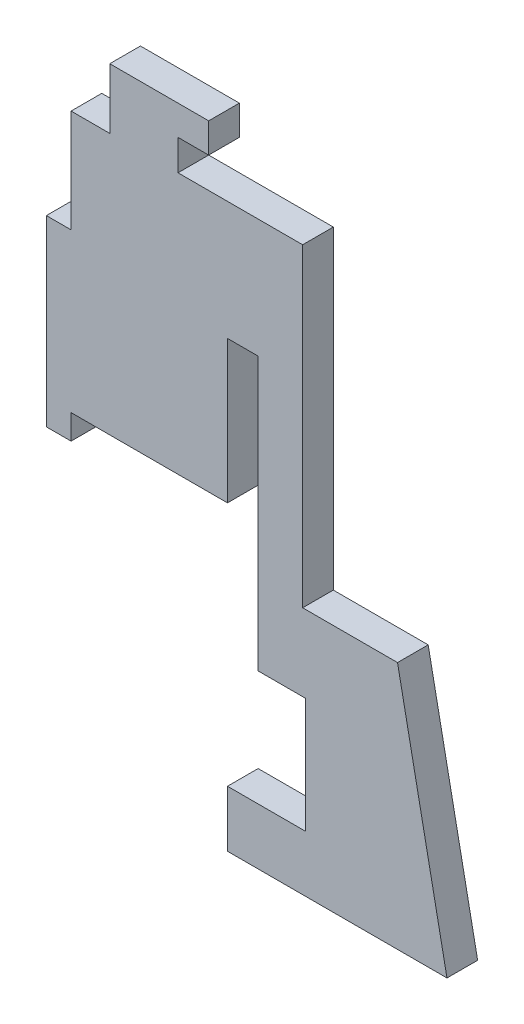
ISO-10303-21;
HEADER;
FILE_DESCRIPTION(('STEP AP214'),'2;1');
FILE_NAME('part.step','',(''),(''),'','','');
FILE_SCHEMA(('AUTOMOTIVE_DESIGN { 1 0 10303 214 1 1 1 1 }'));
ENDSEC;
DATA;
#1=APPLICATION_CONTEXT('core data for automotive mechanical design processes');
#2=APPLICATION_PROTOCOL_DEFINITION('international standard','automotive_design',2000,#1);
#3=PRODUCT_CONTEXT('',#1,'mechanical');
#4=PRODUCT('Part','Part','',(#3));
#5=PRODUCT_RELATED_PRODUCT_CATEGORY('part','',(#4));
#6=PRODUCT_DEFINITION_FORMATION('','',#4);
#7=PRODUCT_DEFINITION_CONTEXT('part definition',#1,'design');
#8=PRODUCT_DEFINITION('design','',#6,#7);
#9=PRODUCT_DEFINITION_SHAPE('','',#8);
#10=(LENGTH_UNIT() NAMED_UNIT(*) SI_UNIT(.MILLI.,.METRE.));
#11=(NAMED_UNIT(*) PLANE_ANGLE_UNIT() SI_UNIT($,.RADIAN.));
#12=(NAMED_UNIT(*) SI_UNIT($,.STERADIAN.) SOLID_ANGLE_UNIT());
#13=UNCERTAINTY_MEASURE_WITH_UNIT(LENGTH_MEASURE(1.E-05),#10,'distance_accuracy_value','');
#14=(GEOMETRIC_REPRESENTATION_CONTEXT(3) GLOBAL_UNCERTAINTY_ASSIGNED_CONTEXT((#13)) GLOBAL_UNIT_ASSIGNED_CONTEXT((#10,
#11,#12)) REPRESENTATION_CONTEXT('',''));
#15=CARTESIAN_POINT('',(0.,0.,0.));
#16=DIRECTION('',(0.,0.,1.));
#17=DIRECTION('',(1.,0.,0.));
#18=AXIS2_PLACEMENT_3D('',#15,#16,#17);
#19=CARTESIAN_POINT('',(-66.09,60.,1.55000000000001));
#20=DIRECTION('',(1.,0.,0.));
#21=DIRECTION('',(0.,0.,-1.));
#22=AXIS2_PLACEMENT_3D('',#19,#20,#21);
#23=PLANE('',#22);
#24=DIRECTION('',(0.,0.,-1.));
#25=VECTOR('',#24,1.);
#26=CARTESIAN_POINT('',(-66.09,66.1,1.55000000000001));
#27=LINE('',#26,#25);
#28=CARTESIAN_POINT('',(-66.09,66.1,1.55000000000001));
#29=VERTEX_POINT('',#28);
#30=CARTESIAN_POINT('',(-66.09,66.1,-1.55));
#31=VERTEX_POINT('',#30);
#32=EDGE_CURVE('E209',#29,#31,#27,.T.);
#33=ORIENTED_EDGE('',*,*,#32,.T.);
#34=DIRECTION('',(0.,-1.,0.));
#35=VECTOR('',#34,1.);
#36=CARTESIAN_POINT('',(-66.09,60.,-1.55));
#37=LINE('',#36,#35);
#38=CARTESIAN_POINT('',(-66.09,60.,-1.55));
#39=VERTEX_POINT('',#38);
#40=EDGE_CURVE('E203',#31,#39,#37,.T.);
#41=ORIENTED_EDGE('',*,*,#40,.T.);
#42=DIRECTION('',(0.,0.,-1.));
#43=VECTOR('',#42,1.);
#44=CARTESIAN_POINT('',(-66.09,60.,1.55000000000001));
#45=LINE('',#44,#43);
#46=CARTESIAN_POINT('',(-66.09,60.,1.55000000000001));
#47=VERTEX_POINT('',#46);
#48=EDGE_CURVE('E11',#47,#39,#45,.T.);
#49=ORIENTED_EDGE('',*,*,#48,.F.);
#50=DIRECTION('',(0.,-1.,0.));
#51=VECTOR('',#50,1.);
#52=CARTESIAN_POINT('',(-66.09,60.,1.55000000000001));
#53=LINE('',#52,#51);
#54=EDGE_CURVE('E275',#29,#47,#53,.T.);
#55=ORIENTED_EDGE('',*,*,#54,.F.);
#56=EDGE_LOOP('',(#33,#41,#49,#55));
#57=FACE_BOUND('',#56,.T.);
#58=ADVANCED_FACE('F31',(#57),#23,.F.);
#59=CARTESIAN_POINT('',(-70.,60.,1.55000000000001));
#60=DIRECTION('',(0.,-1.,0.));
#61=DIRECTION('',(0.,0.,-1.));
#62=AXIS2_PLACEMENT_3D('',#59,#60,#61);
#63=PLANE('',#62);
#64=ORIENTED_EDGE('',*,*,#48,.T.);
#65=DIRECTION('',(-1.,0.,0.));
#66=VECTOR('',#65,1.);
#67=CARTESIAN_POINT('',(-70.,60.,-1.55));
#68=LINE('',#67,#66);
#69=CARTESIAN_POINT('',(-70.,60.,-1.55));
#70=VERTEX_POINT('',#69);
#71=EDGE_CURVE('E193',#39,#70,#68,.T.);
#72=ORIENTED_EDGE('',*,*,#71,.T.);
#73=DIRECTION('',(0.,0.,-1.));
#74=VECTOR('',#73,1.);
#75=CARTESIAN_POINT('',(-70.,60.,1.55000000000001));
#76=LINE('',#75,#74);
#77=CARTESIAN_POINT('',(-70.,60.,1.55000000000001));
#78=VERTEX_POINT('',#77);
#79=EDGE_CURVE('E38',#78,#70,#76,.T.);
#80=ORIENTED_EDGE('',*,*,#79,.F.);
#81=DIRECTION('',(-1.,0.,0.));
#82=VECTOR('',#81,1.);
#83=CARTESIAN_POINT('',(-70.,60.,1.55000000000001));
#84=LINE('',#83,#82);
#85=EDGE_CURVE('E194',#47,#78,#84,.T.);
#86=ORIENTED_EDGE('',*,*,#85,.F.);
#87=EDGE_LOOP('',(#64,#72,#80,#86));
#88=FACE_BOUND('',#87,.T.);
#89=ADVANCED_FACE('F191',(#88),#63,.F.);
#90=CARTESIAN_POINT('',(-70.,60.,1.55000000000001));
#91=DIRECTION('',(1.,0.,0.));
#92=DIRECTION('',(0.,0.,-1.));
#93=AXIS2_PLACEMENT_3D('',#90,#91,#92);
#94=PLANE('',#93);
#95=ORIENTED_EDGE('',*,*,#79,.T.);
#96=DIRECTION('',(0.,-1.,0.));
#97=VECTOR('',#96,1.);
#98=CARTESIAN_POINT('',(-70.,60.,-1.55));
#99=LINE('',#98,#97);
#100=CARTESIAN_POINT('',(-70.,49.6,-1.55));
#101=VERTEX_POINT('',#100);
#102=EDGE_CURVE('E207',#70,#101,#99,.T.);
#103=ORIENTED_EDGE('',*,*,#102,.T.);
#104=DIRECTION('',(0.,0.,-1.));
#105=VECTOR('',#104,1.);
#106=CARTESIAN_POINT('',(-70.,49.6,1.55000000000001));
#107=LINE('',#106,#105);
#108=CARTESIAN_POINT('',(-70.,49.6,1.55000000000001));
#109=VERTEX_POINT('',#108);
#110=EDGE_CURVE('E361',#109,#101,#107,.T.);
#111=ORIENTED_EDGE('',*,*,#110,.F.);
#112=DIRECTION('',(0.,-1.,0.));
#113=VECTOR('',#112,1.);
#114=CARTESIAN_POINT('',(-70.,60.,1.55000000000001));
#115=LINE('',#114,#113);
#116=EDGE_CURVE('E278',#78,#109,#115,.T.);
#117=ORIENTED_EDGE('',*,*,#116,.F.);
#118=EDGE_LOOP('',(#95,#103,#111,#117));
#119=FACE_BOUND('',#118,.T.);
#120=ADVANCED_FACE('F364',(#119),#94,.F.);
#121=CARTESIAN_POINT('',(-70.,49.6,1.55000000000001));
#122=DIRECTION('',(0.,-1.,0.));
#123=DIRECTION('',(0.,0.,-1.));
#124=AXIS2_PLACEMENT_3D('',#121,#122,#123);
#125=PLANE('',#124);
#126=ORIENTED_EDGE('',*,*,#110,.T.);
#127=DIRECTION('',(-1.,0.,0.));
#128=VECTOR('',#127,1.);
#129=CARTESIAN_POINT('',(-70.,49.6,-1.55));
#130=LINE('',#129,#128);
#131=CARTESIAN_POINT('',(-72.5,49.6,-1.55));
#132=VERTEX_POINT('',#131);
#133=EDGE_CURVE('E213',#101,#132,#130,.T.);
#134=ORIENTED_EDGE('',*,*,#133,.T.);
#135=DIRECTION('',(0.,0.,-1.));
#136=VECTOR('',#135,1.);
#137=CARTESIAN_POINT('',(-72.5,49.6,1.55000000000001));
#138=LINE('',#137,#136);
#139=CARTESIAN_POINT('',(-72.5,49.6,1.55000000000001));
#140=VERTEX_POINT('',#139);
#141=EDGE_CURVE('E359',#140,#132,#138,.T.);
#142=ORIENTED_EDGE('',*,*,#141,.F.);
#143=DIRECTION('',(-1.,0.,0.));
#144=VECTOR('',#143,1.);
#145=CARTESIAN_POINT('',(-70.,49.6,1.55000000000001));
#146=LINE('',#145,#144);
#147=EDGE_CURVE('E280',#109,#140,#146,.T.);
#148=ORIENTED_EDGE('',*,*,#147,.F.);
#149=EDGE_LOOP('',(#126,#134,#142,#148));
#150=FACE_BOUND('',#149,.T.);
#151=ADVANCED_FACE('F372',(#150),#125,.F.);
#152=CARTESIAN_POINT('',(-72.5,31.1,1.55000000000001));
#153=DIRECTION('',(1.,0.,0.));
#154=DIRECTION('',(0.,0.,-1.));
#155=AXIS2_PLACEMENT_3D('',#152,#153,#154);
#156=PLANE('',#155);
#157=ORIENTED_EDGE('',*,*,#141,.T.);
#158=DIRECTION('',(0.,-1.,0.));
#159=VECTOR('',#158,1.);
#160=CARTESIAN_POINT('',(-72.5,31.1,-1.55));
#161=LINE('',#160,#159);
#162=CARTESIAN_POINT('',(-72.5,31.1,-1.55));
#163=VERTEX_POINT('',#162);
#164=EDGE_CURVE('E216',#132,#163,#161,.T.);
#165=ORIENTED_EDGE('',*,*,#164,.T.);
#166=DIRECTION('',(0.,0.,-1.));
#167=VECTOR('',#166,1.);
#168=CARTESIAN_POINT('',(-72.5,31.1,1.55000000000001));
#169=LINE('',#168,#167);
#170=CARTESIAN_POINT('',(-72.5,31.1,1.55000000000001));
#171=VERTEX_POINT('',#170);
#172=EDGE_CURVE('E357',#171,#163,#169,.T.);
#173=ORIENTED_EDGE('',*,*,#172,.F.);
#174=DIRECTION('',(0.,-1.,0.));
#175=VECTOR('',#174,1.);
#176=CARTESIAN_POINT('',(-72.5,31.1,1.55000000000001));
#177=LINE('',#176,#175);
#178=EDGE_CURVE('E282',#140,#171,#177,.T.);
#179=ORIENTED_EDGE('',*,*,#178,.F.);
#180=EDGE_LOOP('',(#157,#165,#173,#179));
#181=FACE_BOUND('',#180,.T.);
#182=ADVANCED_FACE('F375',(#181),#156,.F.);
#183=CARTESIAN_POINT('',(-72.5,31.1,1.55000000000001));
#184=DIRECTION('',(0.,1.,0.));
#185=DIRECTION('',(0.,0.,1.));
#186=AXIS2_PLACEMENT_3D('',#183,#184,#185);
#187=PLANE('',#186);
#188=ORIENTED_EDGE('',*,*,#172,.T.);
#189=DIRECTION('',(1.,0.,0.));
#190=VECTOR('',#189,1.);
#191=CARTESIAN_POINT('',(-72.5,31.1,-1.55));
#192=LINE('',#191,#190);
#193=CARTESIAN_POINT('',(-70.,31.1,-1.55));
#194=VERTEX_POINT('',#193);
#195=EDGE_CURVE('E219',#163,#194,#192,.T.);
#196=ORIENTED_EDGE('',*,*,#195,.T.);
#197=DIRECTION('',(0.,0.,-1.));
#198=VECTOR('',#197,1.);
#199=CARTESIAN_POINT('',(-70.,31.1,1.55000000000001));
#200=LINE('',#199,#198);
#201=CARTESIAN_POINT('',(-70.,31.1,1.55000000000001));
#202=VERTEX_POINT('',#201);
#203=EDGE_CURVE('E355',#202,#194,#200,.T.);
#204=ORIENTED_EDGE('',*,*,#203,.F.);
#205=DIRECTION('',(1.,0.,0.));
#206=VECTOR('',#205,1.);
#207=CARTESIAN_POINT('',(-72.5,31.1,1.55000000000001));
#208=LINE('',#207,#206);
#209=EDGE_CURVE('E284',#171,#202,#208,.T.);
#210=ORIENTED_EDGE('',*,*,#209,.F.);
#211=EDGE_LOOP('',(#188,#196,#204,#210));
#212=FACE_BOUND('',#211,.T.);
#213=ADVANCED_FACE('F380',(#212),#187,.F.);
#214=CARTESIAN_POINT('',(-70.,31.1,1.55000000000001));
#215=DIRECTION('',(-1.,0.,0.));
#216=DIRECTION('',(0.,0.,1.));
#217=AXIS2_PLACEMENT_3D('',#214,#215,#216);
#218=PLANE('',#217);
#219=ORIENTED_EDGE('',*,*,#203,.T.);
#220=DIRECTION('',(0.,1.,0.));
#221=VECTOR('',#220,1.);
#222=CARTESIAN_POINT('',(-70.,31.1,-1.55));
#223=LINE('',#222,#221);
#224=CARTESIAN_POINT('',(-70.,33.6,-1.55));
#225=VERTEX_POINT('',#224);
#226=EDGE_CURVE('E222',#194,#225,#223,.T.);
#227=ORIENTED_EDGE('',*,*,#226,.T.);
#228=DIRECTION('',(0.,0.,-1.));
#229=VECTOR('',#228,1.);
#230=CARTESIAN_POINT('',(-70.,33.6,1.55000000000001));
#231=LINE('',#230,#229);
#232=CARTESIAN_POINT('',(-70.,33.6,1.55000000000001));
#233=VERTEX_POINT('',#232);
#234=EDGE_CURVE('E353',#233,#225,#231,.T.);
#235=ORIENTED_EDGE('',*,*,#234,.F.);
#236=DIRECTION('',(0.,1.,0.));
#237=VECTOR('',#236,1.);
#238=CARTESIAN_POINT('',(-70.,31.1,1.55000000000001));
#239=LINE('',#238,#237);
#240=EDGE_CURVE('E286',#202,#233,#239,.T.);
#241=ORIENTED_EDGE('',*,*,#240,.F.);
#242=EDGE_LOOP('',(#219,#227,#235,#241));
#243=FACE_BOUND('',#242,.T.);
#244=ADVANCED_FACE('F386',(#243),#218,.F.);
#245=CARTESIAN_POINT('',(-70.,33.6,1.55000000000001));
#246=DIRECTION('',(0.,1.,0.));
#247=DIRECTION('',(0.,0.,1.));
#248=AXIS2_PLACEMENT_3D('',#245,#246,#247);
#249=PLANE('',#248);
#250=ORIENTED_EDGE('',*,*,#234,.T.);
#251=DIRECTION('',(1.,0.,0.));
#252=VECTOR('',#251,1.);
#253=CARTESIAN_POINT('',(-70.,33.6,-1.55));
#254=LINE('',#253,#252);
#255=CARTESIAN_POINT('',(-54.19,33.6,-1.55));
#256=VERTEX_POINT('',#255);
#257=EDGE_CURVE('E225',#225,#256,#254,.T.);
#258=ORIENTED_EDGE('',*,*,#257,.T.);
#259=DIRECTION('',(0.,0.,-1.));
#260=VECTOR('',#259,1.);
#261=CARTESIAN_POINT('',(-54.19,33.6,1.55000000000001));
#262=LINE('',#261,#260);
#263=CARTESIAN_POINT('',(-54.19,33.6,1.55000000000001));
#264=VERTEX_POINT('',#263);
#265=EDGE_CURVE('E351',#264,#256,#262,.T.);
#266=ORIENTED_EDGE('',*,*,#265,.F.);
#267=DIRECTION('',(1.,0.,0.));
#268=VECTOR('',#267,1.);
#269=CARTESIAN_POINT('',(-70.,33.6,1.55000000000001));
#270=LINE('',#269,#268);
#271=EDGE_CURVE('E288',#233,#264,#270,.T.);
#272=ORIENTED_EDGE('',*,*,#271,.F.);
#273=EDGE_LOOP('',(#250,#258,#266,#272));
#274=FACE_BOUND('',#273,.T.);
#275=ADVANCED_FACE('F390',(#274),#249,.F.);
#276=CARTESIAN_POINT('',(-54.19,33.6,1.55000000000001));
#277=DIRECTION('',(-1.,0.,0.));
#278=DIRECTION('',(0.,0.,1.));
#279=AXIS2_PLACEMENT_3D('',#276,#277,#278);
#280=PLANE('',#279);
#281=ORIENTED_EDGE('',*,*,#265,.T.);
#282=DIRECTION('',(0.,1.,0.));
#283=VECTOR('',#282,1.);
#284=CARTESIAN_POINT('',(-54.19,33.6,-1.55));
#285=LINE('',#284,#283);
#286=CARTESIAN_POINT('',(-54.19,48.,-1.55));
#287=VERTEX_POINT('',#286);
#288=EDGE_CURVE('E228',#256,#287,#285,.T.);
#289=ORIENTED_EDGE('',*,*,#288,.T.);
#290=DIRECTION('',(0.,0.,-1.));
#291=VECTOR('',#290,1.);
#292=CARTESIAN_POINT('',(-54.19,48.,1.55000000000001));
#293=LINE('',#292,#291);
#294=CARTESIAN_POINT('',(-54.19,48.,1.55000000000001));
#295=VERTEX_POINT('',#294);
#296=EDGE_CURVE('E349',#295,#287,#293,.T.);
#297=ORIENTED_EDGE('',*,*,#296,.F.);
#298=DIRECTION('',(0.,1.,0.));
#299=VECTOR('',#298,1.);
#300=CARTESIAN_POINT('',(-54.19,33.6,1.55000000000001));
#301=LINE('',#300,#299);
#302=EDGE_CURVE('E290',#264,#295,#301,.T.);
#303=ORIENTED_EDGE('',*,*,#302,.F.);
#304=EDGE_LOOP('',(#281,#289,#297,#303));
#305=FACE_BOUND('',#304,.T.);
#306=ADVANCED_FACE('F395',(#305),#280,.F.);
#307=CARTESIAN_POINT('',(-54.19,48.,1.55000000000001));
#308=DIRECTION('',(0.,1.,0.));
#309=DIRECTION('',(0.,0.,1.));
#310=AXIS2_PLACEMENT_3D('',#307,#308,#309);
#311=PLANE('',#310);
#312=ORIENTED_EDGE('',*,*,#296,.T.);
#313=DIRECTION('',(1.,0.,0.));
#314=VECTOR('',#313,1.);
#315=CARTESIAN_POINT('',(-54.19,48.,-1.55));
#316=LINE('',#315,#314);
#317=CARTESIAN_POINT('',(-51.09,48.,-1.55));
#318=VERTEX_POINT('',#317);
#319=EDGE_CURVE('E231',#287,#318,#316,.T.);
#320=ORIENTED_EDGE('',*,*,#319,.T.);
#321=DIRECTION('',(0.,0.,-1.));
#322=VECTOR('',#321,1.);
#323=CARTESIAN_POINT('',(-51.09,48.,1.55000000000001));
#324=LINE('',#323,#322);
#325=CARTESIAN_POINT('',(-51.09,48.,1.55000000000001));
#326=VERTEX_POINT('',#325);
#327=EDGE_CURVE('E347',#326,#318,#324,.T.);
#328=ORIENTED_EDGE('',*,*,#327,.F.);
#329=DIRECTION('',(1.,0.,0.));
#330=VECTOR('',#329,1.);
#331=CARTESIAN_POINT('',(-54.19,48.,1.55000000000001));
#332=LINE('',#331,#330);
#333=EDGE_CURVE('E292',#295,#326,#332,.T.);
#334=ORIENTED_EDGE('',*,*,#333,.F.);
#335=EDGE_LOOP('',(#312,#320,#328,#334));
#336=FACE_BOUND('',#335,.T.);
#337=ADVANCED_FACE('F401',(#336),#311,.F.);
#338=CARTESIAN_POINT('',(-51.09,48.,1.55000000000001));
#339=DIRECTION('',(1.,0.,0.));
#340=DIRECTION('',(0.,0.,-1.));
#341=AXIS2_PLACEMENT_3D('',#338,#339,#340);
#342=PLANE('',#341);
#343=ORIENTED_EDGE('',*,*,#327,.T.);
#344=DIRECTION('',(0.,-1.,0.));
#345=VECTOR('',#344,1.);
#346=CARTESIAN_POINT('',(-51.09,48.,-1.55));
#347=LINE('',#346,#345);
#348=CARTESIAN_POINT('',(-51.09,20.4368365897388,-1.55));
#349=VERTEX_POINT('',#348);
#350=EDGE_CURVE('E234',#318,#349,#347,.T.);
#351=ORIENTED_EDGE('',*,*,#350,.T.);
#352=DIRECTION('',(0.,0.,-1.));
#353=VECTOR('',#352,1.);
#354=CARTESIAN_POINT('',(-51.09,20.4368365897388,1.55000000000001));
#355=LINE('',#354,#353);
#356=CARTESIAN_POINT('',(-51.09,20.4368365897388,1.55000000000001));
#357=VERTEX_POINT('',#356);
#358=EDGE_CURVE('E345',#357,#349,#355,.T.);
#359=ORIENTED_EDGE('',*,*,#358,.F.);
#360=DIRECTION('',(0.,-1.,0.));
#361=VECTOR('',#360,1.);
#362=CARTESIAN_POINT('',(-51.09,48.,1.55000000000001));
#363=LINE('',#362,#361);
#364=EDGE_CURVE('E294',#326,#357,#363,.T.);
#365=ORIENTED_EDGE('',*,*,#364,.F.);
#366=EDGE_LOOP('',(#343,#351,#359,#365));
#367=FACE_BOUND('',#366,.T.);
#368=ADVANCED_FACE('F405',(#367),#342,.F.);
#369=CARTESIAN_POINT('',(-51.09,20.4368365897388,1.55000000000001));
#370=DIRECTION('',(0.,1.,0.));
#371=DIRECTION('',(0.,0.,1.));
#372=AXIS2_PLACEMENT_3D('',#369,#370,#371);
#373=PLANE('',#372);
#374=ORIENTED_EDGE('',*,*,#358,.T.);
#375=DIRECTION('',(1.,0.,0.));
#376=VECTOR('',#375,1.);
#377=CARTESIAN_POINT('',(-51.09,20.4368365897388,-1.55));
#378=LINE('',#377,#376);
#379=CARTESIAN_POINT('',(-46.3195404718544,20.4368365897388,-1.55));
#380=VERTEX_POINT('',#379);
#381=EDGE_CURVE('E237',#349,#380,#378,.T.);
#382=ORIENTED_EDGE('',*,*,#381,.T.);
#383=DIRECTION('',(0.,0.,-1.));
#384=VECTOR('',#383,1.);
#385=CARTESIAN_POINT('',(-46.3195404718544,20.4368365897388,1.55000000000001));
#386=LINE('',#385,#384);
#387=CARTESIAN_POINT('',(-46.3195404718544,20.4368365897388,1.55000000000001));
#388=VERTEX_POINT('',#387);
#389=EDGE_CURVE('E343',#388,#380,#386,.T.);
#390=ORIENTED_EDGE('',*,*,#389,.F.);
#391=DIRECTION('',(1.,0.,0.));
#392=VECTOR('',#391,1.);
#393=CARTESIAN_POINT('',(-51.09,20.4368365897388,1.55000000000001));
#394=LINE('',#393,#392);
#395=EDGE_CURVE('E296',#357,#388,#394,.T.);
#396=ORIENTED_EDGE('',*,*,#395,.F.);
#397=EDGE_LOOP('',(#374,#382,#390,#396));
#398=FACE_BOUND('',#397,.T.);
#399=ADVANCED_FACE('F410',(#398),#373,.F.);
#400=CARTESIAN_POINT('',(-46.3195404718544,20.4368365897388,1.55000000000001));
#401=DIRECTION('',(1.,0.,0.));
#402=DIRECTION('',(0.,0.,-1.));
#403=AXIS2_PLACEMENT_3D('',#400,#401,#402);
#404=PLANE('',#403);
#405=ORIENTED_EDGE('',*,*,#389,.T.);
#406=DIRECTION('',(0.,-1.,0.));
#407=VECTOR('',#406,1.);
#408=CARTESIAN_POINT('',(-46.3195404718544,20.4368365897388,-1.55));
#409=LINE('',#408,#407);
#410=CARTESIAN_POINT('',(-46.3195404718544,8.7933976863756,-1.55));
#411=VERTEX_POINT('',#410);
#412=EDGE_CURVE('E240',#380,#411,#409,.T.);
#413=ORIENTED_EDGE('',*,*,#412,.T.);
#414=DIRECTION('',(0.,0.,-1.));
#415=VECTOR('',#414,1.);
#416=CARTESIAN_POINT('',(-46.3195404718544,8.7933976863756,1.55000000000001));
#417=LINE('',#416,#415);
#418=CARTESIAN_POINT('',(-46.3195404718544,8.7933976863756,1.55000000000001));
#419=VERTEX_POINT('',#418);
#420=EDGE_CURVE('E341',#419,#411,#417,.T.);
#421=ORIENTED_EDGE('',*,*,#420,.F.);
#422=DIRECTION('',(0.,-1.,0.));
#423=VECTOR('',#422,1.);
#424=CARTESIAN_POINT('',(-46.3195404718544,20.4368365897388,1.55000000000001));
#425=LINE('',#424,#423);
#426=EDGE_CURVE('E298',#388,#419,#425,.T.);
#427=ORIENTED_EDGE('',*,*,#426,.F.);
#428=EDGE_LOOP('',(#405,#413,#421,#427));
#429=FACE_BOUND('',#428,.T.);
#430=ADVANCED_FACE('F416',(#429),#404,.F.);
#431=CARTESIAN_POINT('',(-46.3195404718544,8.7933976863756,1.55000000000001));
#432=DIRECTION('',(0.,-1.,0.));
#433=DIRECTION('',(1.,0.,0.));
#434=AXIS2_PLACEMENT_3D('',#431,#432,#433);
#435=PLANE('',#434);
#436=ORIENTED_EDGE('',*,*,#420,.T.);
#437=DIRECTION('',(-1.,0.,0.));
#438=VECTOR('',#437,1.);
#439=CARTESIAN_POINT('',(-46.3195404718544,8.7933976863756,-1.55));
#440=LINE('',#439,#438);
#441=CARTESIAN_POINT('',(-54.19,8.7933976863756,-1.55));
#442=VERTEX_POINT('',#441);
#443=EDGE_CURVE('E243',#411,#442,#440,.T.);
#444=ORIENTED_EDGE('',*,*,#443,.T.);
#445=DIRECTION('',(0.,0.,-1.));
#446=VECTOR('',#445,1.);
#447=CARTESIAN_POINT('',(-54.19,8.7933976863756,1.55000000000001));
#448=LINE('',#447,#446);
#449=CARTESIAN_POINT('',(-54.19,8.7933976863756,1.55000000000001));
#450=VERTEX_POINT('',#449);
#451=EDGE_CURVE('E339',#450,#442,#448,.T.);
#452=ORIENTED_EDGE('',*,*,#451,.F.);
#453=DIRECTION('',(-1.,0.,0.));
#454=VECTOR('',#453,1.);
#455=CARTESIAN_POINT('',(-46.3195404718544,8.7933976863756,1.55000000000001));
#456=LINE('',#455,#454);
#457=EDGE_CURVE('E300',#419,#450,#456,.T.);
#458=ORIENTED_EDGE('',*,*,#457,.F.);
#459=EDGE_LOOP('',(#436,#444,#452,#458));
#460=FACE_BOUND('',#459,.T.);
#461=ADVANCED_FACE('F420',(#460),#435,.F.);
#462=CARTESIAN_POINT('',(-54.19,8.7933976863756,1.55000000000001));
#463=DIRECTION('',(1.,0.,0.));
#464=DIRECTION('',(0.,1.,0.));
#465=AXIS2_PLACEMENT_3D('',#462,#463,#464);
#466=PLANE('',#465);
#467=ORIENTED_EDGE('',*,*,#451,.T.);
#468=DIRECTION('',(0.,-1.,0.));
#469=VECTOR('',#468,1.);
#470=CARTESIAN_POINT('',(-54.19,8.7933976863756,-1.55));
#471=LINE('',#470,#469);
#472=CARTESIAN_POINT('',(-54.19,3.09999999999997,-1.55));
#473=VERTEX_POINT('',#472);
#474=EDGE_CURVE('E246',#442,#473,#471,.T.);
#475=ORIENTED_EDGE('',*,*,#474,.T.);
#476=DIRECTION('',(0.,0.,-1.));
#477=VECTOR('',#476,1.);
#478=CARTESIAN_POINT('',(-54.19,3.09999999999997,1.55000000000001));
#479=LINE('',#478,#477);
#480=CARTESIAN_POINT('',(-54.19,3.09999999999997,1.55000000000001));
#481=VERTEX_POINT('',#480);
#482=EDGE_CURVE('E337',#481,#473,#479,.T.);
#483=ORIENTED_EDGE('',*,*,#482,.F.);
#484=DIRECTION('',(0.,-1.,0.));
#485=VECTOR('',#484,1.);
#486=CARTESIAN_POINT('',(-54.19,8.7933976863756,1.55000000000001));
#487=LINE('',#486,#485);
#488=EDGE_CURVE('E302',#450,#481,#487,.T.);
#489=ORIENTED_EDGE('',*,*,#488,.F.);
#490=EDGE_LOOP('',(#467,#475,#483,#489));
#491=FACE_BOUND('',#490,.T.);
#492=ADVANCED_FACE('F425',(#491),#466,.F.);
#493=CARTESIAN_POINT('',(-32.,3.09999999999997,1.55000000000001));
#494=DIRECTION('',(0.,1.,0.));
#495=DIRECTION('',(-1.,0.,0.));
#496=AXIS2_PLACEMENT_3D('',#493,#494,#495);
#497=PLANE('',#496);
#498=ORIENTED_EDGE('',*,*,#482,.T.);
#499=DIRECTION('',(1.,0.,0.));
#500=VECTOR('',#499,1.);
#501=CARTESIAN_POINT('',(-32.,3.09999999999997,-1.55));
#502=LINE('',#501,#500);
#503=CARTESIAN_POINT('',(-32.,3.09999999999997,-1.55));
#504=VERTEX_POINT('',#503);
#505=EDGE_CURVE('E249',#473,#504,#502,.T.);
#506=ORIENTED_EDGE('',*,*,#505,.T.);
#507=DIRECTION('',(0.,0.,-1.));
#508=VECTOR('',#507,1.);
#509=CARTESIAN_POINT('',(-32.,3.09999999999997,1.55000000000001));
#510=LINE('',#509,#508);
#511=CARTESIAN_POINT('',(-32.,3.09999999999997,1.55000000000001));
#512=VERTEX_POINT('',#511);
#513=EDGE_CURVE('E335',#512,#504,#510,.T.);
#514=ORIENTED_EDGE('',*,*,#513,.F.);
#515=DIRECTION('',(1.,0.,0.));
#516=VECTOR('',#515,1.);
#517=CARTESIAN_POINT('',(-32.,3.09999999999997,1.55000000000001));
#518=LINE('',#517,#516);
#519=EDGE_CURVE('E304',#481,#512,#518,.T.);
#520=ORIENTED_EDGE('',*,*,#519,.F.);
#521=EDGE_LOOP('',(#498,#506,#514,#520));
#522=FACE_BOUND('',#521,.T.);
#523=ADVANCED_FACE('F431',(#522),#497,.F.);
#524=CARTESIAN_POINT('',(-37.,28.2165527599059,1.55000000000001));
#525=DIRECTION('',(-0.980755330155965,-0.195240831719863,0.));
#526=DIRECTION('',(0.195240831719863,-0.980755330155965,0.));
#527=AXIS2_PLACEMENT_3D('',#524,#525,#526);
#528=PLANE('',#527);
#529=ORIENTED_EDGE('',*,*,#513,.T.);
#530=DIRECTION('',(-0.195240831719863,0.980755330155965,0.));
#531=VECTOR('',#530,1.);
#532=CARTESIAN_POINT('',(-37.,28.2165527599059,-1.55));
#533=LINE('',#532,#531);
#534=CARTESIAN_POINT('',(-37.,28.2165527599059,-1.55));
#535=VERTEX_POINT('',#534);
#536=EDGE_CURVE('E252',#504,#535,#533,.T.);
#537=ORIENTED_EDGE('',*,*,#536,.T.);
#538=DIRECTION('',(0.,0.,-1.));
#539=VECTOR('',#538,1.);
#540=CARTESIAN_POINT('',(-37.,28.2165527599059,1.55000000000001));
#541=LINE('',#540,#539);
#542=CARTESIAN_POINT('',(-37.,28.2165527599059,1.55000000000001));
#543=VERTEX_POINT('',#542);
#544=EDGE_CURVE('E333',#543,#535,#541,.T.);
#545=ORIENTED_EDGE('',*,*,#544,.F.);
#546=DIRECTION('',(-0.195240831719863,0.980755330155965,0.));
#547=VECTOR('',#546,1.);
#548=CARTESIAN_POINT('',(-37.,28.2165527599059,1.55000000000001));
#549=LINE('',#548,#547);
#550=EDGE_CURVE('E306',#512,#543,#549,.T.);
#551=ORIENTED_EDGE('',*,*,#550,.F.);
#552=EDGE_LOOP('',(#529,#537,#545,#551));
#553=FACE_BOUND('',#552,.T.);
#554=ADVANCED_FACE('F435',(#553),#528,.F.);
#555=CARTESIAN_POINT('',(-37.,28.2165527599059,1.55000000000001));
#556=DIRECTION('',(0.,-1.,0.));
#557=DIRECTION('',(1.,0.,0.));
#558=AXIS2_PLACEMENT_3D('',#555,#556,#557);
#559=PLANE('',#558);
#560=ORIENTED_EDGE('',*,*,#544,.T.);
#561=DIRECTION('',(-1.,0.,0.));
#562=VECTOR('',#561,1.);
#563=CARTESIAN_POINT('',(-37.,28.2165527599059,-1.55));
#564=LINE('',#563,#562);
#565=CARTESIAN_POINT('',(-46.59,28.2165527599059,-1.55));
#566=VERTEX_POINT('',#565);
#567=EDGE_CURVE('E255',#535,#566,#564,.T.);
#568=ORIENTED_EDGE('',*,*,#567,.T.);
#569=DIRECTION('',(0.,0.,-1.));
#570=VECTOR('',#569,1.);
#571=CARTESIAN_POINT('',(-46.59,28.2165527599059,1.55000000000001));
#572=LINE('',#571,#570);
#573=CARTESIAN_POINT('',(-46.59,28.2165527599059,1.55000000000001));
#574=VERTEX_POINT('',#573);
#575=EDGE_CURVE('E331',#574,#566,#572,.T.);
#576=ORIENTED_EDGE('',*,*,#575,.F.);
#577=DIRECTION('',(-1.,0.,0.));
#578=VECTOR('',#577,1.);
#579=CARTESIAN_POINT('',(-37.,28.2165527599059,1.55000000000001));
#580=LINE('',#579,#578);
#581=EDGE_CURVE('E308',#543,#574,#580,.T.);
#582=ORIENTED_EDGE('',*,*,#581,.F.);
#583=EDGE_LOOP('',(#560,#568,#576,#582));
#584=FACE_BOUND('',#583,.T.);
#585=ADVANCED_FACE('F440',(#584),#559,.F.);
#586=CARTESIAN_POINT('',(-46.59,28.2165527599059,1.55000000000001));
#587=DIRECTION('',(-1.,0.,0.));
#588=DIRECTION('',(0.,0.,1.));
#589=AXIS2_PLACEMENT_3D('',#586,#587,#588);
#590=PLANE('',#589);
#591=ORIENTED_EDGE('',*,*,#575,.T.);
#592=DIRECTION('',(0.,1.,0.));
#593=VECTOR('',#592,1.);
#594=CARTESIAN_POINT('',(-46.59,28.2165527599059,-1.55));
#595=LINE('',#594,#593);
#596=CARTESIAN_POINT('',(-46.59,60.,-1.55));
#597=VERTEX_POINT('',#596);
#598=EDGE_CURVE('E258',#566,#597,#595,.T.);
#599=ORIENTED_EDGE('',*,*,#598,.T.);
#600=DIRECTION('',(0.,0.,-1.));
#601=VECTOR('',#600,1.);
#602=CARTESIAN_POINT('',(-46.59,60.,1.55000000000001));
#603=LINE('',#602,#601);
#604=CARTESIAN_POINT('',(-46.59,60.,1.55000000000001));
#605=VERTEX_POINT('',#604);
#606=EDGE_CURVE('E329',#605,#597,#603,.T.);
#607=ORIENTED_EDGE('',*,*,#606,.F.);
#608=DIRECTION('',(0.,1.,0.));
#609=VECTOR('',#608,1.);
#610=CARTESIAN_POINT('',(-46.59,28.2165527599059,1.55000000000001));
#611=LINE('',#610,#609);
#612=EDGE_CURVE('E310',#574,#605,#611,.T.);
#613=ORIENTED_EDGE('',*,*,#612,.F.);
#614=EDGE_LOOP('',(#591,#599,#607,#613));
#615=FACE_BOUND('',#614,.T.);
#616=ADVANCED_FACE('F446',(#615),#590,.F.);
#617=CARTESIAN_POINT('',(-59.19,60.,1.55000000000001));
#618=DIRECTION('',(0.,-1.,0.));
#619=DIRECTION('',(0.,0.,-1.));
#620=AXIS2_PLACEMENT_3D('',#617,#618,#619);
#621=PLANE('',#620);
#622=ORIENTED_EDGE('',*,*,#606,.T.);
#623=DIRECTION('',(-1.,0.,0.));
#624=VECTOR('',#623,1.);
#625=CARTESIAN_POINT('',(-59.19,60.,-1.55));
#626=LINE('',#625,#624);
#627=CARTESIAN_POINT('',(-59.19,60.,-1.55));
#628=VERTEX_POINT('',#627);
#629=EDGE_CURVE('E261',#597,#628,#626,.T.);
#630=ORIENTED_EDGE('',*,*,#629,.T.);
#631=DIRECTION('',(0.,0.,-1.));
#632=VECTOR('',#631,1.);
#633=CARTESIAN_POINT('',(-59.19,60.,1.55000000000001));
#634=LINE('',#633,#632);
#635=CARTESIAN_POINT('',(-59.19,60.,1.55000000000001));
#636=VERTEX_POINT('',#635);
#637=EDGE_CURVE('E327',#636,#628,#634,.T.);
#638=ORIENTED_EDGE('',*,*,#637,.F.);
#639=DIRECTION('',(-1.,0.,0.));
#640=VECTOR('',#639,1.);
#641=CARTESIAN_POINT('',(-59.19,60.,1.55000000000001));
#642=LINE('',#641,#640);
#643=EDGE_CURVE('E312',#605,#636,#642,.T.);
#644=ORIENTED_EDGE('',*,*,#643,.F.);
#645=EDGE_LOOP('',(#622,#630,#638,#644));
#646=FACE_BOUND('',#645,.T.);
#647=ADVANCED_FACE('F450',(#646),#621,.F.);
#648=CARTESIAN_POINT('',(-59.19,60.,1.55000000000001));
#649=DIRECTION('',(-1.,0.,0.));
#650=DIRECTION('',(0.,0.,1.));
#651=AXIS2_PLACEMENT_3D('',#648,#649,#650);
#652=PLANE('',#651);
#653=ORIENTED_EDGE('',*,*,#637,.T.);
#654=DIRECTION('',(0.,1.,0.));
#655=VECTOR('',#654,1.);
#656=CARTESIAN_POINT('',(-59.19,60.,-1.55));
#657=LINE('',#656,#655);
#658=CARTESIAN_POINT('',(-59.19,63.1,-1.55));
#659=VERTEX_POINT('',#658);
#660=EDGE_CURVE('E264',#628,#659,#657,.T.);
#661=ORIENTED_EDGE('',*,*,#660,.T.);
#662=DIRECTION('',(0.,0.,-1.));
#663=VECTOR('',#662,1.);
#664=CARTESIAN_POINT('',(-59.19,63.1,1.55000000000001));
#665=LINE('',#664,#663);
#666=CARTESIAN_POINT('',(-59.19,63.1,1.55000000000001));
#667=VERTEX_POINT('',#666);
#668=EDGE_CURVE('E325',#667,#659,#665,.T.);
#669=ORIENTED_EDGE('',*,*,#668,.F.);
#670=DIRECTION('',(0.,1.,0.));
#671=VECTOR('',#670,1.);
#672=CARTESIAN_POINT('',(-59.19,60.,1.55000000000001));
#673=LINE('',#672,#671);
#674=EDGE_CURVE('E314',#636,#667,#673,.T.);
#675=ORIENTED_EDGE('',*,*,#674,.F.);
#676=EDGE_LOOP('',(#653,#661,#669,#675));
#677=FACE_BOUND('',#676,.T.);
#678=ADVANCED_FACE('F455',(#677),#652,.F.);
#679=CARTESIAN_POINT('',(-59.19,63.1,1.55000000000001));
#680=DIRECTION('',(0.,1.,0.));
#681=DIRECTION('',(-1.,0.,0.));
#682=AXIS2_PLACEMENT_3D('',#679,#680,#681);
#683=PLANE('',#682);
#684=ORIENTED_EDGE('',*,*,#668,.T.);
#685=DIRECTION('',(1.,0.,0.));
#686=VECTOR('',#685,1.);
#687=CARTESIAN_POINT('',(-59.19,63.1,-1.55));
#688=LINE('',#687,#686);
#689=CARTESIAN_POINT('',(-56.09,63.1,-1.55));
#690=VERTEX_POINT('',#689);
#691=EDGE_CURVE('E267',#659,#690,#688,.T.);
#692=ORIENTED_EDGE('',*,*,#691,.T.);
#693=DIRECTION('',(0.,0.,-1.));
#694=VECTOR('',#693,1.);
#695=CARTESIAN_POINT('',(-56.09,63.1,1.55000000000001));
#696=LINE('',#695,#694);
#697=CARTESIAN_POINT('',(-56.09,63.1,1.55000000000001));
#698=VERTEX_POINT('',#697);
#699=EDGE_CURVE('E323',#698,#690,#696,.T.);
#700=ORIENTED_EDGE('',*,*,#699,.F.);
#701=DIRECTION('',(1.,0.,0.));
#702=VECTOR('',#701,1.);
#703=CARTESIAN_POINT('',(-59.19,63.1,1.55000000000001));
#704=LINE('',#703,#702);
#705=EDGE_CURVE('E316',#667,#698,#704,.T.);
#706=ORIENTED_EDGE('',*,*,#705,.F.);
#707=EDGE_LOOP('',(#684,#692,#700,#706));
#708=FACE_BOUND('',#707,.T.);
#709=ADVANCED_FACE('F459',(#708),#683,.F.);
#710=CARTESIAN_POINT('',(-56.09,63.1,1.55000000000001));
#711=DIRECTION('',(-1.,0.,0.));
#712=DIRECTION('',(0.,0.,1.));
#713=AXIS2_PLACEMENT_3D('',#710,#711,#712);
#714=PLANE('',#713);
#715=ORIENTED_EDGE('',*,*,#699,.T.);
#716=DIRECTION('',(0.,1.,0.));
#717=VECTOR('',#716,1.);
#718=CARTESIAN_POINT('',(-56.09,63.1,-1.55));
#719=LINE('',#718,#717);
#720=CARTESIAN_POINT('',(-56.09,66.1,-1.55));
#721=VERTEX_POINT('',#720);
#722=EDGE_CURVE('E270',#690,#721,#719,.T.);
#723=ORIENTED_EDGE('',*,*,#722,.T.);
#724=DIRECTION('',(0.,0.,-1.));
#725=VECTOR('',#724,1.);
#726=CARTESIAN_POINT('',(-56.09,66.1,1.55000000000001));
#727=LINE('',#726,#725);
#728=CARTESIAN_POINT('',(-56.09,66.1,1.55000000000001));
#729=VERTEX_POINT('',#728);
#730=EDGE_CURVE('E321',#729,#721,#727,.T.);
#731=ORIENTED_EDGE('',*,*,#730,.F.);
#732=DIRECTION('',(0.,1.,0.));
#733=VECTOR('',#732,1.);
#734=CARTESIAN_POINT('',(-56.09,63.1,1.55000000000001));
#735=LINE('',#734,#733);
#736=EDGE_CURVE('E50',#698,#729,#735,.T.);
#737=ORIENTED_EDGE('',*,*,#736,.F.);
#738=EDGE_LOOP('',(#715,#723,#731,#737));
#739=FACE_BOUND('',#738,.T.);
#740=ADVANCED_FACE('F463',(#739),#714,.F.);
#741=CARTESIAN_POINT('',(-66.09,66.1,1.55000000000001));
#742=DIRECTION('',(0.,-1.,0.));
#743=DIRECTION('',(0.,0.,-1.));
#744=AXIS2_PLACEMENT_3D('',#741,#742,#743);
#745=PLANE('',#744);
#746=ORIENTED_EDGE('',*,*,#730,.T.);
#747=DIRECTION('',(-1.,0.,0.));
#748=VECTOR('',#747,1.);
#749=CARTESIAN_POINT('',(-66.09,66.1,-1.55));
#750=LINE('',#749,#748);
#751=EDGE_CURVE('E273',#721,#31,#750,.T.);
#752=ORIENTED_EDGE('',*,*,#751,.T.);
#753=ORIENTED_EDGE('',*,*,#32,.F.);
#754=DIRECTION('',(-1.,0.,0.));
#755=VECTOR('',#754,1.);
#756=CARTESIAN_POINT('',(-66.09,66.1,1.55000000000001));
#757=LINE('',#756,#755);
#758=EDGE_CURVE('E45',#729,#29,#757,.T.);
#759=ORIENTED_EDGE('',*,*,#758,.F.);
#760=EDGE_LOOP('',(#746,#752,#753,#759));
#761=FACE_BOUND('',#760,.T.);
#762=ADVANCED_FACE('F465',(#761),#745,.F.);
#763=CARTESIAN_POINT('',(-66.09,66.1,1.55000000000001));
#764=DIRECTION('',(0.,0.,-1.));
#765=DIRECTION('',(-1.,0.,0.));
#766=AXIS2_PLACEMENT_3D('',#763,#764,#765);
#767=PLANE('',#766);
#768=ORIENTED_EDGE('',*,*,#54,.T.);
#769=ORIENTED_EDGE('',*,*,#85,.T.);
#770=ORIENTED_EDGE('',*,*,#116,.T.);
#771=ORIENTED_EDGE('',*,*,#147,.T.);
#772=ORIENTED_EDGE('',*,*,#178,.T.);
#773=ORIENTED_EDGE('',*,*,#209,.T.);
#774=ORIENTED_EDGE('',*,*,#240,.T.);
#775=ORIENTED_EDGE('',*,*,#271,.T.);
#776=ORIENTED_EDGE('',*,*,#302,.T.);
#777=ORIENTED_EDGE('',*,*,#333,.T.);
#778=ORIENTED_EDGE('',*,*,#364,.T.);
#779=ORIENTED_EDGE('',*,*,#395,.T.);
#780=ORIENTED_EDGE('',*,*,#426,.T.);
#781=ORIENTED_EDGE('',*,*,#457,.T.);
#782=ORIENTED_EDGE('',*,*,#488,.T.);
#783=ORIENTED_EDGE('',*,*,#519,.T.);
#784=ORIENTED_EDGE('',*,*,#550,.T.);
#785=ORIENTED_EDGE('',*,*,#581,.T.);
#786=ORIENTED_EDGE('',*,*,#612,.T.);
#787=ORIENTED_EDGE('',*,*,#643,.T.);
#788=ORIENTED_EDGE('',*,*,#674,.T.);
#789=ORIENTED_EDGE('',*,*,#705,.T.);
#790=ORIENTED_EDGE('',*,*,#736,.T.);
#791=ORIENTED_EDGE('',*,*,#758,.T.);
#792=EDGE_LOOP('',(#768,#769,#770,#771,#772,#773,#774,#775,#776,#777,#778,#779,#780,#781,#782,
#783,#784,#785,#786,#787,#788,#789,#790,#791));
#793=FACE_BOUND('',#792,.T.);
#794=ADVANCED_FACE('F367',(#793),#767,.F.);
#795=CARTESIAN_POINT('',(-66.09,66.1,-1.55));
#796=DIRECTION('',(0.,0.,-1.));
#797=DIRECTION('',(-1.,0.,0.));
#798=AXIS2_PLACEMENT_3D('',#795,#796,#797);
#799=PLANE('',#798);
#800=ORIENTED_EDGE('',*,*,#40,.F.);
#801=ORIENTED_EDGE('',*,*,#751,.F.);
#802=ORIENTED_EDGE('',*,*,#722,.F.);
#803=ORIENTED_EDGE('',*,*,#691,.F.);
#804=ORIENTED_EDGE('',*,*,#660,.F.);
#805=ORIENTED_EDGE('',*,*,#629,.F.);
#806=ORIENTED_EDGE('',*,*,#598,.F.);
#807=ORIENTED_EDGE('',*,*,#567,.F.);
#808=ORIENTED_EDGE('',*,*,#536,.F.);
#809=ORIENTED_EDGE('',*,*,#505,.F.);
#810=ORIENTED_EDGE('',*,*,#474,.F.);
#811=ORIENTED_EDGE('',*,*,#443,.F.);
#812=ORIENTED_EDGE('',*,*,#412,.F.);
#813=ORIENTED_EDGE('',*,*,#381,.F.);
#814=ORIENTED_EDGE('',*,*,#350,.F.);
#815=ORIENTED_EDGE('',*,*,#319,.F.);
#816=ORIENTED_EDGE('',*,*,#288,.F.);
#817=ORIENTED_EDGE('',*,*,#257,.F.);
#818=ORIENTED_EDGE('',*,*,#226,.F.);
#819=ORIENTED_EDGE('',*,*,#195,.F.);
#820=ORIENTED_EDGE('',*,*,#164,.F.);
#821=ORIENTED_EDGE('',*,*,#133,.F.);
#822=ORIENTED_EDGE('',*,*,#102,.F.);
#823=ORIENTED_EDGE('',*,*,#71,.F.);
#824=EDGE_LOOP('',(#800,#801,#802,#803,#804,#805,#806,#807,#808,#809,#810,#811,#812,#813,#814,
#815,#816,#817,#818,#819,#820,#821,#822,#823));
#825=FACE_BOUND('',#824,.T.);
#826=ADVANCED_FACE('F201',(#825),#799,.T.);
#827=CLOSED_SHELL('',(#58,#89,#120,#151,#182,#213,#244,#275,#306,#337,#368,#399,#430,#461,#492,
#523,#554,#585,#616,#647,#678,#709,#740,#762,#794,#826));
#828=MANIFOLD_SOLID_BREP('B2',#827);
#829=ADVANCED_BREP_SHAPE_REPRESENTATION('',(#18,#828),#14);
#830=SHAPE_DEFINITION_REPRESENTATION(#9,#829);
ENDSEC;
END-ISO-10303-21;
